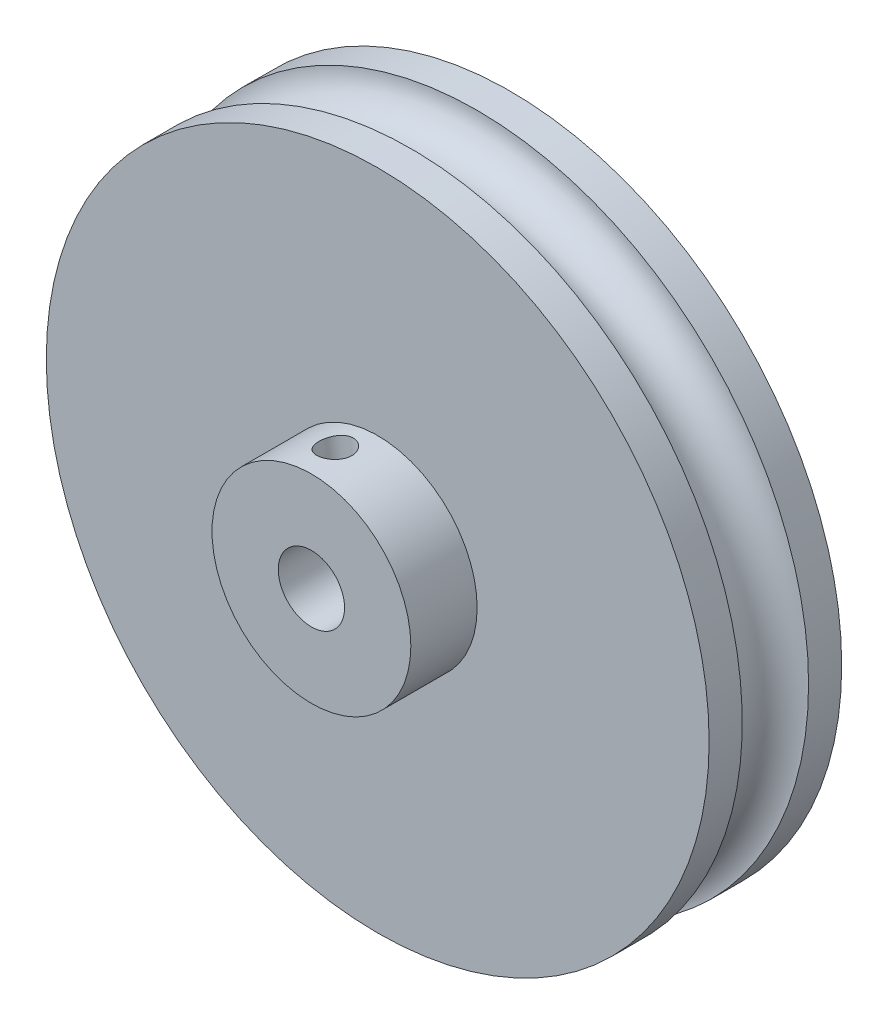
ISO-10303-21;
HEADER;
FILE_DESCRIPTION(('STEP AP214'),'2;1');
FILE_NAME('part.step','',(''),(''),'','','');
FILE_SCHEMA(('AUTOMOTIVE_DESIGN { 1 0 10303 214 1 1 1 1 }'));
ENDSEC;
DATA;
#1=APPLICATION_CONTEXT('core data for automotive mechanical design processes');
#2=APPLICATION_PROTOCOL_DEFINITION('international standard','automotive_design',2000,#1);
#3=PRODUCT_CONTEXT('',#1,'mechanical');
#4=PRODUCT('Part','Part','',(#3));
#5=PRODUCT_RELATED_PRODUCT_CATEGORY('part','',(#4));
#6=PRODUCT_DEFINITION_FORMATION('','',#4);
#7=PRODUCT_DEFINITION_CONTEXT('part definition',#1,'design');
#8=PRODUCT_DEFINITION('design','',#6,#7);
#9=PRODUCT_DEFINITION_SHAPE('','',#8);
#10=(LENGTH_UNIT() NAMED_UNIT(*) SI_UNIT(.MILLI.,.METRE.));
#11=(NAMED_UNIT(*) PLANE_ANGLE_UNIT() SI_UNIT($,.RADIAN.));
#12=(NAMED_UNIT(*) SI_UNIT($,.STERADIAN.) SOLID_ANGLE_UNIT());
#13=UNCERTAINTY_MEASURE_WITH_UNIT(LENGTH_MEASURE(1.E-05),#10,'distance_accuracy_value','');
#14=(GEOMETRIC_REPRESENTATION_CONTEXT(3) GLOBAL_UNCERTAINTY_ASSIGNED_CONTEXT((#13)) GLOBAL_UNIT_ASSIGNED_CONTEXT((#10,
#11,#12)) REPRESENTATION_CONTEXT('',''));
#15=CARTESIAN_POINT('',(0.,0.,0.));
#16=DIRECTION('',(0.,0.,1.));
#17=DIRECTION('',(1.,0.,0.));
#18=AXIS2_PLACEMENT_3D('',#15,#16,#17);
#19=CARTESIAN_POINT('',(0.,0.,10.));
#20=DIRECTION('',(0.,0.,-1.));
#21=DIRECTION('',(-1.,0.,0.));
#22=AXIS2_PLACEMENT_3D('',#19,#20,#21);
#23=CYLINDRICAL_SURFACE('',#22,25.);
#24=CARTESIAN_POINT('',(0.,0.,2.5));
#25=DIRECTION('',(0.,0.,1.));
#26=DIRECTION('',(1.,0.,0.));
#27=AXIS2_PLACEMENT_3D('',#24,#25,#26);
#28=CIRCLE('',#27,25.);
#29=CARTESIAN_POINT('',(25.,0.,2.5));
#30=VERTEX_POINT('',#29);
#31=EDGE_CURVE('E63',#30,#30,#28,.F.);
#32=ORIENTED_EDGE('',*,*,#31,.T.);
#33=EDGE_LOOP('',(#32));
#34=FACE_BOUND('',#33,.T.);
#35=CARTESIAN_POINT('',(0.,0.,0.));
#36=DIRECTION('',(0.,0.,1.));
#37=DIRECTION('',(1.,0.,0.));
#38=AXIS2_PLACEMENT_3D('',#35,#36,#37);
#39=CIRCLE('',#38,25.);
#40=CARTESIAN_POINT('',(25.,0.,0.));
#41=VERTEX_POINT('',#40);
#42=EDGE_CURVE('E55',#41,#41,#39,.T.);
#43=ORIENTED_EDGE('',*,*,#42,.T.);
#44=EDGE_LOOP('',(#43));
#45=FACE_BOUND('',#44,.T.);
#46=ADVANCED_FACE('F35',(#34,#45),#23,.T.);
#47=CARTESIAN_POINT('',(0.,0.,0.));
#48=DIRECTION('',(0.,0.,1.));
#49=DIRECTION('',(1.,0.,0.));
#50=AXIS2_PLACEMENT_3D('',#47,#48,#49);
#51=PLANE('',#50);
#52=CARTESIAN_POINT('',(0.,0.,0.));
#53=DIRECTION('',(0.,0.,1.));
#54=DIRECTION('',(1.,0.,0.));
#55=AXIS2_PLACEMENT_3D('',#52,#53,#54);
#56=CIRCLE('',#55,2.5);
#57=CARTESIAN_POINT('',(2.5,0.,0.));
#58=VERTEX_POINT('',#57);
#59=EDGE_CURVE('E119',#58,#58,#56,.T.);
#60=ORIENTED_EDGE('',*,*,#59,.T.);
#61=EDGE_LOOP('',(#60));
#62=FACE_BOUND('',#61,.T.);
#63=ORIENTED_EDGE('',*,*,#42,.F.);
#64=EDGE_LOOP('',(#63));
#65=FACE_BOUND('',#64,.T.);
#66=ADVANCED_FACE('F74',(#62,#65),#51,.F.);
#67=CARTESIAN_POINT('',(0.,0.,5.));
#68=DIRECTION('',(0.,0.,-1.));
#69=DIRECTION('',(-1.,0.,0.));
#70=AXIS2_PLACEMENT_3D('',#67,#68,#69);
#71=TOROIDAL_SURFACE('',#70,25.,2.5);
#72=CARTESIAN_POINT('',(0.,0.,7.5));
#73=DIRECTION('',(0.,0.,-1.));
#74=DIRECTION('',(-1.,0.,0.));
#75=AXIS2_PLACEMENT_3D('',#72,#73,#74);
#76=CIRCLE('',#75,25.);
#77=CARTESIAN_POINT('',(-25.,0.,7.5));
#78=VERTEX_POINT('',#77);
#79=EDGE_CURVE('E64',#78,#78,#76,.F.);
#80=ORIENTED_EDGE('',*,*,#79,.F.);
#81=EDGE_LOOP('',(#80));
#82=FACE_BOUND('',#81,.T.);
#83=ORIENTED_EDGE('',*,*,#31,.F.);
#84=EDGE_LOOP('',(#83));
#85=FACE_BOUND('',#84,.T.);
#86=ADVANCED_FACE('F71',(#82,#85),#71,.F.);
#87=CARTESIAN_POINT('',(0.,0.,10.));
#88=DIRECTION('',(0.,0.,1.));
#89=DIRECTION('',(1.,0.,0.));
#90=AXIS2_PLACEMENT_3D('',#87,#88,#89);
#91=PLANE('',#90);
#92=CARTESIAN_POINT('',(0.,0.,10.));
#93=DIRECTION('',(0.,0.,1.));
#94=DIRECTION('',(1.,0.,0.));
#95=AXIS2_PLACEMENT_3D('',#92,#93,#94);
#96=CIRCLE('',#95,7.5);
#97=CARTESIAN_POINT('',(7.5,0.,10.));
#98=VERTEX_POINT('',#97);
#99=EDGE_CURVE('E46',#98,#98,#96,.T.);
#100=ORIENTED_EDGE('',*,*,#99,.F.);
#101=EDGE_LOOP('',(#100));
#102=FACE_BOUND('',#101,.T.);
#103=CARTESIAN_POINT('',(0.,0.,10.));
#104=DIRECTION('',(0.,0.,1.));
#105=DIRECTION('',(1.,0.,0.));
#106=AXIS2_PLACEMENT_3D('',#103,#104,#105);
#107=CIRCLE('',#106,25.);
#108=CARTESIAN_POINT('',(25.,0.,10.));
#109=VERTEX_POINT('',#108);
#110=EDGE_CURVE('E50',#109,#109,#107,.T.);
#111=ORIENTED_EDGE('',*,*,#110,.T.);
#112=EDGE_LOOP('',(#111));
#113=FACE_BOUND('',#112,.T.);
#114=ADVANCED_FACE('F73',(#102,#113),#91,.T.);
#115=ORIENTED_EDGE('',*,*,#79,.T.);
#116=EDGE_LOOP('',(#115));
#117=FACE_BOUND('',#116,.T.);
#118=ORIENTED_EDGE('',*,*,#110,.F.);
#119=EDGE_LOOP('',(#118));
#120=FACE_BOUND('',#119,.T.);
#121=ADVANCED_FACE('F37',(#117,#120),#23,.T.);
#122=CARTESIAN_POINT('',(0.,0.,15.));
#123=DIRECTION('',(0.,0.,-1.));
#124=DIRECTION('',(-1.,0.,0.));
#125=AXIS2_PLACEMENT_3D('',#122,#123,#124);
#126=CYLINDRICAL_SURFACE('',#125,7.5);
#127=CARTESIAN_POINT('',(-2.15167182096949,7.18472743914798,12.279526522179));
#128=CARTESIAN_POINT('',(-2.15166919654485,7.18472903279566,12.209838648106));
#129=CARTESIAN_POINT('',(-2.14599165442923,7.18643608241615,12.1401127191665));
#130=CARTESIAN_POINT('',(-2.12343113333711,7.19313376853776,12.0026172505689));
#131=CARTESIAN_POINT('',(-2.10653782063452,7.19812743314698,11.9348495753042));
#132=CARTESIAN_POINT('',(-2.06204079357534,7.21099996385296,11.8032803805006));
#133=CARTESIAN_POINT('',(-2.03444603035064,7.21887641835727,11.7394755978458));
#134=CARTESIAN_POINT('',(-1.96930604356427,7.23691720677636,11.6175360448221));
#135=CARTESIAN_POINT('',(-1.93176193976716,7.24708128320765,11.5594006373909));
#136=CARTESIAN_POINT('',(-1.84733785737672,7.26906161962896,11.4498700973062));
#137=CARTESIAN_POINT('',(-1.80037843454607,7.28089166500533,11.3985389564857));
#138=CARTESIAN_POINT('',(-1.69856334044842,7.30531436869229,11.3046298687482));
#139=CARTESIAN_POINT('',(-1.64370720150865,7.31790707214471,11.2620524406213));
#140=CARTESIAN_POINT('',(-1.52718987663555,7.3431096654365,11.1866192385693));
#141=CARTESIAN_POINT('',(-1.46549002095907,7.35571920909071,11.1538230183131));
#142=CARTESIAN_POINT('',(-1.33723805459271,7.38011179347778,11.0992659869137));
#143=CARTESIAN_POINT('',(-1.27068625972357,7.39189488790779,11.0775044582366));
#144=CARTESIAN_POINT('',(-1.13523597809752,7.41389920188197,11.045830254687));
#145=CARTESIAN_POINT('',(-1.06636482249795,7.42413383424087,11.0358100641766));
#146=CARTESIAN_POINT('',(-0.927673232988084,7.44273578358827,11.0275686451027));
#147=CARTESIAN_POINT('',(-0.857852863922841,7.45110322745955,11.0293466145554));
#148=CARTESIAN_POINT('',(-0.719979039201221,7.46568083987248,11.0445671979431));
#149=CARTESIAN_POINT('',(-0.651914932431482,7.47191155449702,11.0578941038836));
#150=CARTESIAN_POINT('',(-0.518777972050278,7.48233460250294,11.0956520593022));
#151=CARTESIAN_POINT('',(-0.453705209608375,7.48652687379433,11.1200834469737));
#152=CARTESIAN_POINT('',(-0.328092542347056,7.4930856845092,11.1794718423367));
#153=CARTESIAN_POINT('',(-0.267574754711132,7.49544377715751,11.2144765282202));
#154=CARTESIAN_POINT('',(-0.153090713411956,7.4986564147934,11.2939829334965));
#155=CARTESIAN_POINT('',(-0.0991249905539259,7.49951083803915,11.3384854215344));
#156=CARTESIAN_POINT('',(0.00135247776290692,7.50017052614383,11.4363659254886));
#157=CARTESIAN_POINT('',(0.047765848107928,7.49996293679449,11.4898450696295));
#158=CARTESIAN_POINT('',(0.13097958982285,7.49897202779381,11.6038200672869));
#159=CARTESIAN_POINT('',(0.1677798725194,7.49818870283201,11.6643159855204));
#160=CARTESIAN_POINT('',(0.23068669301335,7.49651784343256,11.7907223431177));
#161=CARTESIAN_POINT('',(0.25678120690729,7.49563019325579,11.856638771225));
#162=CARTESIAN_POINT('',(0.297381891232108,7.49412975379717,11.9919510583328));
#163=CARTESIAN_POINT('',(0.311889082023546,7.49351694031575,12.0613466103952));
#164=CARTESIAN_POINT('',(0.328736064384357,7.49279679615703,12.2007596002601));
#165=CARTESIAN_POINT('',(0.331219105073118,7.49268351577838,12.27075971203));
#166=CARTESIAN_POINT('',(0.324324661642171,7.49298505064516,12.4101698580244));
#167=CARTESIAN_POINT('',(0.314947635629289,7.49339984549315,12.479579914936));
#168=CARTESIAN_POINT('',(0.284737853337781,7.49460793956798,12.6153904017744));
#169=CARTESIAN_POINT('',(0.263977936847661,7.49539882792307,12.681807092118));
#170=CARTESIAN_POINT('',(0.211702490068451,7.49705687943399,12.8102616053187));
#171=CARTESIAN_POINT('',(0.180186316354946,7.49792404715043,12.8722991659544));
#172=CARTESIAN_POINT('',(0.107004269350934,7.49932642045709,12.990863819382));
#173=CARTESIAN_POINT('',(0.0652474613389421,7.49985849041697,13.047334808557));
#174=CARTESIAN_POINT('',(-0.0270452520796438,7.5000928626012,13.1525832885265));
#175=CARTESIAN_POINT('',(-0.0775817749688628,7.4997951064412,13.2013602377338));
#176=CARTESIAN_POINT('',(-0.186568745073936,7.49787886990597,13.2903524685433));
#177=CARTESIAN_POINT('',(-0.245096029471676,7.49624668651082,13.3304734353212));
#178=CARTESIAN_POINT('',(-0.367972858275713,7.49121962840511,13.4003541856814));
#179=CARTESIAN_POINT('',(-0.432322214265056,7.48782481072101,13.4301143044159));
#180=CARTESIAN_POINT('',(-0.56468891806868,7.47900414269575,13.4782818141564));
#181=CARTESIAN_POINT('',(-0.632688888918051,7.47358729072679,13.4967385600464));
#182=CARTESIAN_POINT('',(-0.770627777094176,7.46062518719707,13.5219343216609));
#183=CARTESIAN_POINT('',(-0.840566534399094,7.45308011082495,13.5286743015452));
#184=CARTESIAN_POINT('',(-0.979482303097523,7.43609122031357,13.5302174633351));
#185=CARTESIAN_POINT('',(-1.04846070843963,7.42667149537911,13.5251641491495));
#186=CARTESIAN_POINT('',(-1.18434770847279,7.40621650977856,13.5035745610443));
#187=CARTESIAN_POINT('',(-1.25125631475169,7.39518125815903,13.4870383514242));
#188=CARTESIAN_POINT('',(-1.38107792676211,7.37203975453004,13.4430074394071));
#189=CARTESIAN_POINT('',(-1.44399529103691,7.35993470659767,13.4155249380737));
#190=CARTESIAN_POINT('',(-1.56424120111375,7.33532007885774,13.3503975540639));
#191=CARTESIAN_POINT('',(-1.6215694818073,7.32281047989845,13.3127521896485));
#192=CARTESIAN_POINT('',(-1.72977210887098,7.29801405401759,13.227858975948));
#193=CARTESIAN_POINT('',(-1.78056498066005,7.28573142188565,13.1805060448005));
#194=CARTESIAN_POINT('',(-1.87360086845542,7.26236370944385,13.0777623682299));
#195=CARTESIAN_POINT('',(-1.91584187906994,7.25127891030656,13.0223697427332));
#196=CARTESIAN_POINT('',(-1.99090925420305,7.23103084070481,12.9046538609252));
#197=CARTESIAN_POINT('',(-2.02366691059875,7.22188171681963,12.84228435226));
#198=CARTESIAN_POINT('',(-2.0784306425403,7.20631275404598,12.7127219042233));
#199=CARTESIAN_POINT('',(-2.10044745889022,7.19989018944524,12.6455338608305));
#200=CARTESIAN_POINT('',(-2.12836345415127,7.19167635771979,12.5283246374406));
#201=CARTESIAN_POINT('',(-2.13709080285043,7.18908061882478,12.4790131181998));
#202=CARTESIAN_POINT('',(-2.14874587645475,7.18560560259297,12.3796497797584));
#203=CARTESIAN_POINT('',(-2.15167370664548,7.18472629409578,12.3295979740139));
#204=CARTESIAN_POINT('',(-2.15167182096949,7.18472743914798,12.279526522179));
#205=B_SPLINE_CURVE_WITH_KNOTS('',3,(#127,#128,#129,#130,#131,#132,#133,#134,#135,#136,#137,
#138,#139,#140,#141,#142,#143,#144,#145,#146,#147,#148,#149,#150,#151,#152,#153,#154,#155,#156,
#157,#158,#159,#160,#161,#162,#163,#164,#165,#166,#167,#168,#169,#170,#171,#172,#173,#174,#175,
#176,#177,#178,#179,#180,#181,#182,#183,#184,#185,#186,#187,#188,#189,#190,#191,#192,#193,#194,
#195,#196,#197,#198,#199,#200,#201,#202,#203,#204),.UNSPECIFIED.,.T.,.F.,(4,2,2,2,2,2,2,2,2,2,2,
2,2,2,2,2,2,2,2,2,2,2,2,2,2,2,2,2,2,2,2,2,2,2,2,2,2,2,4),(0.,0.208880519452658,
0.417953759959721,0.626852498915826,0.835727737004602,1.0464457957568,1.25717633915046,
1.4691649005354,1.68113967553379,1.89115783734105,2.10116172324168,2.30908560580156,
2.51701582122588,2.72589802067534,2.93479713111203,3.14623061728883,3.3576660537083,
3.56933831247122,3.78099192966859,3.99011771208026,4.19923541704808,4.40703032315566,
4.61483766144607,4.82456171379171,5.03430052213164,5.2462205651551,5.45813375236168,
5.66911492206642,5.88007872953994,6.08848888130777,6.2968978660723,6.50507519914046,
6.71326240193986,6.92383498729444,7.13445689438723,7.34656863806419,7.55846783368807,
7.70855335268462,7.85863614697488),.UNSPECIFIED.);
#206=CARTESIAN_POINT('',(-2.15167182096949,7.18472743914798,12.279526522179));
#207=VERTEX_POINT('',#206);
#208=EDGE_CURVE('E10',#207,#207,#205,.T.);
#209=ORIENTED_EDGE('',*,*,#208,.T.);
#210=EDGE_LOOP('',(#209));
#211=FACE_BOUND('',#210,.T.);
#212=CARTESIAN_POINT('',(0.,0.,15.));
#213=DIRECTION('',(0.,0.,1.));
#214=DIRECTION('',(1.,0.,0.));
#215=AXIS2_PLACEMENT_3D('',#212,#213,#214);
#216=CIRCLE('',#215,7.5);
#217=CARTESIAN_POINT('',(7.5,0.,15.));
#218=VERTEX_POINT('',#217);
#219=EDGE_CURVE('E58',#218,#218,#216,.T.);
#220=ORIENTED_EDGE('',*,*,#219,.F.);
#221=EDGE_LOOP('',(#220));
#222=FACE_BOUND('',#221,.T.);
#223=ORIENTED_EDGE('',*,*,#99,.T.);
#224=EDGE_LOOP('',(#223));
#225=FACE_BOUND('',#224,.T.);
#226=ADVANCED_FACE('F89',(#211,#222,#225),#126,.T.);
#227=CARTESIAN_POINT('',(0.,0.,15.));
#228=DIRECTION('',(0.,0.,1.));
#229=DIRECTION('',(1.,0.,0.));
#230=AXIS2_PLACEMENT_3D('',#227,#228,#229);
#231=PLANE('',#230);
#232=CARTESIAN_POINT('',(0.,0.,15.));
#233=DIRECTION('',(0.,0.,1.));
#234=DIRECTION('',(1.,0.,0.));
#235=AXIS2_PLACEMENT_3D('',#232,#233,#234);
#236=CIRCLE('',#235,2.5);
#237=CARTESIAN_POINT('',(2.5,0.,15.));
#238=VERTEX_POINT('',#237);
#239=EDGE_CURVE('E118',#238,#238,#236,.T.);
#240=ORIENTED_EDGE('',*,*,#239,.F.);
#241=EDGE_LOOP('',(#240));
#242=FACE_BOUND('',#241,.T.);
#243=ORIENTED_EDGE('',*,*,#219,.T.);
#244=EDGE_LOOP('',(#243));
#245=FACE_BOUND('',#244,.T.);
#246=ADVANCED_FACE('F94',(#242,#245),#231,.T.);
#247=CARTESIAN_POINT('',(0.,0.,0.));
#248=DIRECTION('',(0.,0.,1.));
#249=DIRECTION('',(1.,0.,0.));
#250=AXIS2_PLACEMENT_3D('',#247,#248,#249);
#251=CYLINDRICAL_SURFACE('',#250,2.5);
#252=CARTESIAN_POINT('',(-1.50724596726756,1.99454495917131,12.279526522179));
#253=CARTESIAN_POINT('',(-1.50724215496206,1.99455115073497,12.344661282423));
#254=CARTESIAN_POINT('',(-1.50252766249273,1.9981377141277,12.4098782865853));
#255=CARTESIAN_POINT('',(-1.48387557641025,2.01202383601303,12.5383106030254));
#256=CARTESIAN_POINT('',(-1.46991860207679,2.02233749999431,12.6015214159832));
#257=CARTESIAN_POINT('',(-1.43343845707054,2.04835259567205,12.7238411026089));
#258=CARTESIAN_POINT('',(-1.41096081742603,2.06402534767747,12.782969837771));
#259=CARTESIAN_POINT('',(-1.35808785230365,2.09919089431023,12.8963067746749));
#260=CARTESIAN_POINT('',(-1.3276920984873,2.11868389558372,12.950514710007));
#261=CARTESIAN_POINT('',(-1.25675179503948,2.16158012030134,13.0574086828759));
#262=CARTESIAN_POINT('',(-1.21557696402813,2.18517324752962,13.1096004417709));
#263=CARTESIAN_POINT('',(-1.12528567622144,2.23301213797479,13.2062870076874));
#264=CARTESIAN_POINT('',(-1.07616528156511,2.25725821980715,13.2507779754084));
#265=CARTESIAN_POINT('',(-0.967140066088665,2.30617444515663,13.3337354611136));
#266=CARTESIAN_POINT('',(-0.90673148684936,2.33076300562297,13.3715937320034));
#267=CARTESIAN_POINT('',(-0.778957345735832,2.37651361420034,13.4359525887362));
#268=CARTESIAN_POINT('',(-0.711596207810599,2.39767781949774,13.4624603423504));
#269=CARTESIAN_POINT('',(-0.57679575646951,2.43347861977193,13.5014073488053));
#270=CARTESIAN_POINT('',(-0.509703051697775,2.44847252970828,13.5147134301234));
#271=CARTESIAN_POINT('',(-0.373265038275562,2.47294671323649,13.5297341705228));
#272=CARTESIAN_POINT('',(-0.303921118143041,2.48243031976281,13.5314558431736));
#273=CARTESIAN_POINT('',(-0.171431283529477,2.49492588800689,13.523593179716));
#274=CARTESIAN_POINT('',(-0.108270776351138,2.49842891203876,13.5149790027774));
#275=CARTESIAN_POINT('',(0.0161353739857131,2.50072212269402,13.4884254672981));
#276=CARTESIAN_POINT('',(0.0773808734922728,2.49951195661409,13.4704854109587));
#277=CARTESIAN_POINT('',(0.197218425557159,2.49294195036499,13.4256733145667));
#278=CARTESIAN_POINT('',(0.255762042958258,2.48752492930243,13.3986811307139));
#279=CARTESIAN_POINT('',(0.368010401777479,2.47341328244206,13.3366972519271));
#280=CARTESIAN_POINT('',(0.421713401187324,2.46471748248879,13.301702693051));
#281=CARTESIAN_POINT('',(0.528069877307699,2.44424732891469,13.2209073327627));
#282=CARTESIAN_POINT('',(0.580144286071187,2.432259668334,13.1743977367715));
#283=CARTESIAN_POINT('',(0.676159629371876,2.40733747239384,13.0737893660163));
#284=CARTESIAN_POINT('',(0.720094304866576,2.39440221896038,13.0196848068364));
#285=CARTESIAN_POINT('',(0.801140684712369,2.36856441572135,12.9012162816489));
#286=CARTESIAN_POINT('',(0.837641927006879,2.35571610722838,12.8364189933612));
#287=CARTESIAN_POINT('',(0.898509392294749,2.33318339837966,12.7008544329802));
#288=CARTESIAN_POINT('',(0.922888277511372,2.32349570031051,12.630093480907));
#289=CARTESIAN_POINT('',(0.956661929187863,2.30978526195711,12.4905083830755));
#290=CARTESIAN_POINT('',(0.967091025259245,2.3053744360419,12.4219751233745));
#291=CARTESIAN_POINT('',(0.975719600370928,2.3017382025902,12.2840248452833));
#292=CARTESIAN_POINT('',(0.973927718202702,2.30250913215764,12.2146084857792));
#293=CARTESIAN_POINT('',(0.959133925797311,2.30870286328783,12.0849591239556));
#294=CARTESIAN_POINT('',(0.947379734088622,2.3136075666826,12.0245522082941));
#295=CARTESIAN_POINT('',(0.91491250103185,2.32663678381753,11.9065667893403));
#296=CARTESIAN_POINT('',(0.894196558403838,2.33476234020623,11.8489892087457));
#297=CARTESIAN_POINT('',(0.843488887105177,2.35356896269258,11.7352623585506));
#298=CARTESIAN_POINT('',(0.813111986146736,2.36435095765116,11.679302751112));
#299=CARTESIAN_POINT('',(0.744430675112755,2.38686581890033,11.5726899327552));
#300=CARTESIAN_POINT('',(0.706122192908249,2.39859917173467,11.5220394677874));
#301=CARTESIAN_POINT('',(0.61718259760073,2.42311146293526,11.4208030627746));
#302=CARTESIAN_POINT('',(0.565606872124301,2.43583576145291,11.3710300837819));
#303=CARTESIAN_POINT('',(0.454738418262468,2.4589467148491,11.280261224687));
#304=CARTESIAN_POINT('',(0.395443093996186,2.46933258015815,11.2392683093908));
#305=CARTESIAN_POINT('',(0.268860117650539,2.48634130859524,11.1663093647414));
#306=CARTESIAN_POINT('',(0.201402834201743,2.49285762506133,11.1346101244154));
#307=CARTESIAN_POINT('',(0.0618072918192659,2.5002096145098,11.0831041423573));
#308=CARTESIAN_POINT('',(-0.0103267948858912,2.50105028227583,11.0632869579711));
#309=CARTESIAN_POINT('',(-0.150013617327433,2.49638257266746,11.0378158169607));
#310=CARTESIAN_POINT('',(-0.217379438795017,2.49144966054638,11.0310291773339));
#311=CARTESIAN_POINT('',(-0.351678607369748,2.47606208523073,11.028472440361));
#312=CARTESIAN_POINT('',(-0.418612097644212,2.46560935602199,11.0326984865245));
#313=CARTESIAN_POINT('',(-0.545545479368752,2.44055190868838,11.0512970306735));
#314=CARTESIAN_POINT('',(-0.60571162598908,2.42626617027503,11.0649825837511));
#315=CARTESIAN_POINT('',(-0.72230926689563,2.39414465339197,11.1011852713077));
#316=CARTESIAN_POINT('',(-0.778740224250254,2.37630836600302,11.1237036722958));
#317=CARTESIAN_POINT('',(-0.889052344906135,2.33733928098831,11.1779353373865));
#318=CARTESIAN_POINT('',(-0.942721223149362,2.31609811839788,11.2100006761888));
#319=CARTESIAN_POINT('',(-1.04390634140643,2.27229058844349,11.2819739357528));
#320=CARTESIAN_POINT('',(-1.09141973885301,2.24972361577001,11.3218854585736));
#321=CARTESIAN_POINT('',(-1.18404872832596,2.20249688224866,11.4130229459574));
#322=CARTESIAN_POINT('',(-1.22845510472783,2.17785235610287,11.4649796315255));
#323=CARTESIAN_POINT('',(-1.30835021480217,2.13081550994022,11.5763399235912));
#324=CARTESIAN_POINT('',(-1.34383106029936,2.1084251925473,11.6357500482636));
#325=CARTESIAN_POINT('',(-1.40600347535015,2.06750722856336,11.7628223304052));
#326=CARTESIAN_POINT('',(-1.43238185304955,2.04912401048285,11.8306859360899));
#327=CARTESIAN_POINT('',(-1.47368013583966,2.01963545600832,11.9711920276037));
#328=CARTESIAN_POINT('',(-1.48863836624446,2.00850579569033,12.0438176333199));
#329=CARTESIAN_POINT('',(-1.5007577041158,1.99943407304245,12.144283216744));
#330=CARTESIAN_POINT('',(-1.50318740004207,1.99760647326436,12.1712363901763));
#331=CARTESIAN_POINT('',(-1.50643237933196,1.99516058680854,12.2252971230318));
#332=CARTESIAN_POINT('',(-1.50724755469491,1.99454238103126,12.2524046926613));
#333=CARTESIAN_POINT('',(-1.50724596726756,1.99454495917131,12.279526522179));
#334=B_SPLINE_CURVE_WITH_KNOTS('',3,(#252,#253,#254,#255,#256,#257,#258,#259,#260,#261,#262,
#263,#264,#265,#266,#267,#268,#269,#270,#271,#272,#273,#274,#275,#276,#277,#278,#279,#280,#281,
#282,#283,#284,#285,#286,#287,#288,#289,#290,#291,#292,#293,#294,#295,#296,#297,#298,#299,#300,
#301,#302,#303,#304,#305,#306,#307,#308,#309,#310,#311,#312,#313,#314,#315,#316,#317,#318,#319,
#320,#321,#322,#323,#324,#325,#326,#327,#328,#329,#330,#331,#332,#333),.UNSPECIFIED.,.T.,.F.,(4,
2,2,2,2,2,2,2,2,2,2,2,2,2,2,2,2,2,2,2,2,2,2,2,2,2,2,2,2,2,2,2,2,2,2,2,2,2,2,2,4),(0.,
0.195290153243392,0.390991116031002,0.585660744898603,0.78034090680643,0.991077890622785,
1.20191963855463,1.42697365298453,1.65188533704862,1.86079356209917,2.06957529607548,
2.26020121855671,2.45084140646817,2.64411918413931,2.83746624187837,3.04908989321111,
3.26087560307395,3.48611052161807,3.71110967764628,3.91827863567761,4.12530116485462,
4.30967729280028,4.49411315545075,4.68709120507605,4.88016857775055,5.09758429475762,
5.31507331222748,5.53830226766202,5.76133474760959,5.96390337986853,6.16640108492459,
6.3555553108936,6.5447366689001,6.74200938399334,6.93937287625893,7.15637802312578,
7.37357428556436,7.59763436298249,7.82093916253443,7.90225168981629,7.98356965618168),.UNSPECIFIED.);
#335=CARTESIAN_POINT('',(-1.50724596726756,1.99454495917131,12.279526522179));
#336=VERTEX_POINT('',#335);
#337=EDGE_CURVE('E113',#336,#336,#334,.T.);
#338=ORIENTED_EDGE('',*,*,#337,.T.);
#339=EDGE_LOOP('',(#338));
#340=FACE_BOUND('',#339,.T.);
#341=ORIENTED_EDGE('',*,*,#59,.F.);
#342=EDGE_LOOP('',(#341));
#343=FACE_BOUND('',#342,.T.);
#344=ORIENTED_EDGE('',*,*,#239,.T.);
#345=EDGE_LOOP('',(#344));
#346=FACE_BOUND('',#345,.T.);
#347=ADVANCED_FACE('F101',(#340,#343,#346),#251,.F.);
#348=CARTESIAN_POINT('',(-0.924122453459134,7.44284876179898,12.279526522179));
#349=DIRECTION('',(-0.123216327127885,0.992379834906531,0.));
#350=DIRECTION('',(-0.992379834906531,-0.123216327127885,0.));
#351=AXIS2_PLACEMENT_3D('',#348,#349,#350);
#352=CYLINDRICAL_SURFACE('',#351,1.24999999999999);
#353=ORIENTED_EDGE('',*,*,#208,.F.);
#354=EDGE_LOOP('',(#353));
#355=FACE_BOUND('',#354,.T.);
#356=ORIENTED_EDGE('',*,*,#337,.F.);
#357=EDGE_LOOP('',(#356));
#358=FACE_BOUND('',#357,.T.);
#359=ADVANCED_FACE('F109',(#355,#358),#352,.F.);
#360=CLOSED_SHELL('',(#46,#66,#86,#114,#121,#226,#246,#347,#359));
#361=MANIFOLD_SOLID_BREP('B2',#360);
#362=ADVANCED_BREP_SHAPE_REPRESENTATION('',(#18,#361),#14);
#363=SHAPE_DEFINITION_REPRESENTATION(#9,#362);
ENDSEC;
END-ISO-10303-21;
